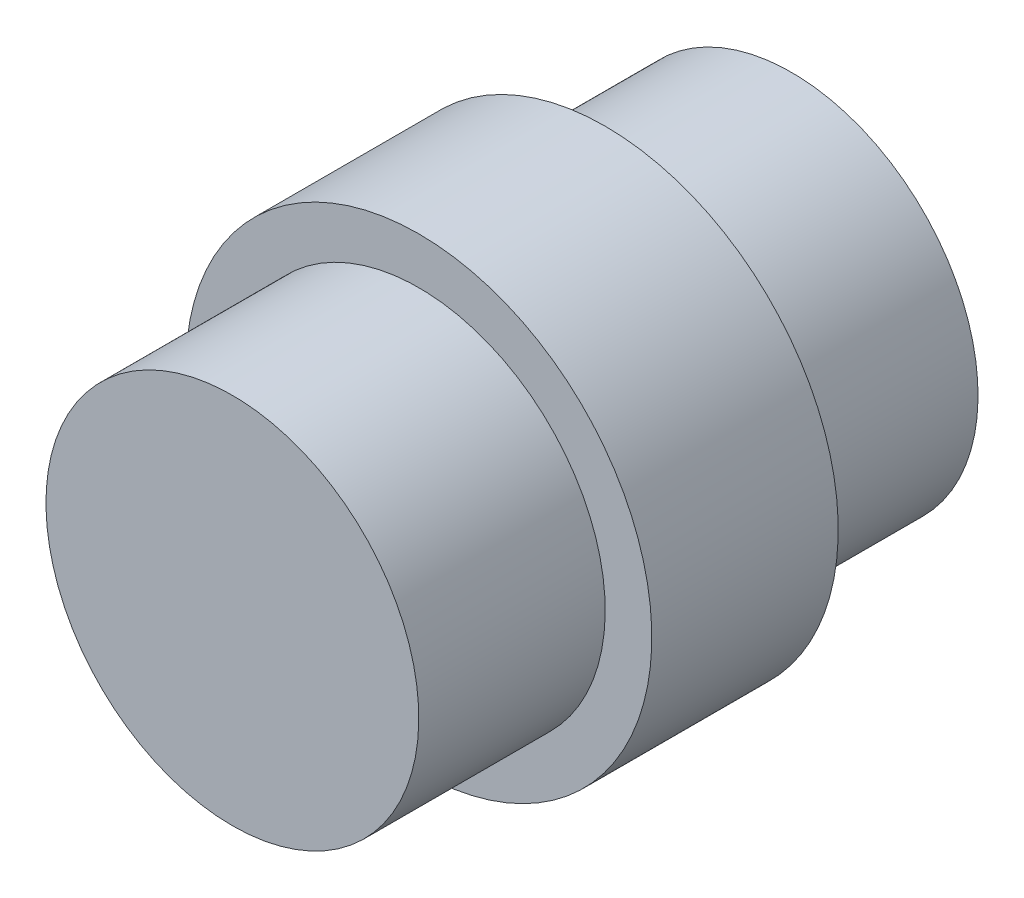
ISO-10303-21;
HEADER;
FILE_DESCRIPTION(('STEP AP214'),'2;1');
FILE_NAME('part.step','',(''),(''),'','','');
FILE_SCHEMA(('AUTOMOTIVE_DESIGN { 1 0 10303 214 1 1 1 1 }'));
ENDSEC;
DATA;
#1=APPLICATION_CONTEXT('core data for automotive mechanical design processes');
#2=APPLICATION_PROTOCOL_DEFINITION('international standard','automotive_design',2000,#1);
#3=PRODUCT_CONTEXT('',#1,'mechanical');
#4=PRODUCT('Part','Part','',(#3));
#5=PRODUCT_RELATED_PRODUCT_CATEGORY('part','',(#4));
#6=PRODUCT_DEFINITION_FORMATION('','',#4);
#7=PRODUCT_DEFINITION_CONTEXT('part definition',#1,'design');
#8=PRODUCT_DEFINITION('design','',#6,#7);
#9=PRODUCT_DEFINITION_SHAPE('','',#8);
#10=(LENGTH_UNIT() NAMED_UNIT(*) SI_UNIT(.MILLI.,.METRE.));
#11=(NAMED_UNIT(*) PLANE_ANGLE_UNIT() SI_UNIT($,.RADIAN.));
#12=(NAMED_UNIT(*) SI_UNIT($,.STERADIAN.) SOLID_ANGLE_UNIT());
#13=UNCERTAINTY_MEASURE_WITH_UNIT(LENGTH_MEASURE(1.E-05),#10,'distance_accuracy_value','');
#14=(GEOMETRIC_REPRESENTATION_CONTEXT(3) GLOBAL_UNCERTAINTY_ASSIGNED_CONTEXT((#13)) GLOBAL_UNIT_ASSIGNED_CONTEXT((#10,
#11,#12)) REPRESENTATION_CONTEXT('',''));
#15=CARTESIAN_POINT('',(0.,0.,0.));
#16=DIRECTION('',(0.,0.,1.));
#17=DIRECTION('',(1.,0.,0.));
#18=AXIS2_PLACEMENT_3D('',#15,#16,#17);
#19=CARTESIAN_POINT('',(-4.99999999999997,0.,4.00000000000003));
#20=DIRECTION('',(0.,0.,-1.));
#21=DIRECTION('',(0.,1.,0.));
#22=AXIS2_PLACEMENT_3D('',#19,#20,#21);
#23=PLANE('',#22);
#24=CARTESIAN_POINT('',(0.,0.,4.));
#25=DIRECTION('',(0.,0.,1.));
#26=DIRECTION('',(0.,-1.,0.));
#27=AXIS2_PLACEMENT_3D('',#24,#25,#26);
#28=CIRCLE('',#27,4.);
#29=CARTESIAN_POINT('',(0.,-4.00000000000001,3.99999999999999));
#30=VERTEX_POINT('',#29);
#31=EDGE_CURVE('E65',#30,#30,#28,.T.);
#32=ORIENTED_EDGE('',*,*,#31,.T.);
#33=EDGE_LOOP('',(#32));
#34=FACE_BOUND('',#33,.T.);
#35=CARTESIAN_POINT('',(0.,0.,4.));
#36=DIRECTION('',(0.,0.,-1.));
#37=DIRECTION('',(0.,1.,0.));
#38=AXIS2_PLACEMENT_3D('',#35,#36,#37);
#39=CIRCLE('',#38,5.);
#40=CARTESIAN_POINT('',(0.,4.99999999999999,4.00000000000002));
#41=VERTEX_POINT('',#40);
#42=EDGE_CURVE('E54',#41,#41,#39,.F.);
#43=ORIENTED_EDGE('',*,*,#42,.F.);
#44=EDGE_LOOP('',(#43));
#45=FACE_BOUND('',#44,.T.);
#46=ADVANCED_FACE('F45',(#34,#45),#23,.T.);
#47=CARTESIAN_POINT('',(0.,0.,6.));
#48=DIRECTION('',(0.,0.,1.));
#49=DIRECTION('',(0.,-1.,0.));
#50=AXIS2_PLACEMENT_3D('',#47,#48,#49);
#51=CYLINDRICAL_SURFACE('',#50,4.);
#52=CARTESIAN_POINT('',(0.,0.,0.));
#53=DIRECTION('',(0.,0.,1.));
#54=DIRECTION('',(0.,-1.,0.));
#55=AXIS2_PLACEMENT_3D('',#52,#53,#54);
#56=CIRCLE('',#55,4.);
#57=CARTESIAN_POINT('',(0.,-4.,0.));
#58=VERTEX_POINT('',#57);
#59=EDGE_CURVE('E49',#58,#58,#56,.T.);
#60=ORIENTED_EDGE('',*,*,#59,.T.);
#61=EDGE_LOOP('',(#60));
#62=FACE_BOUND('',#61,.T.);
#63=ORIENTED_EDGE('',*,*,#31,.F.);
#64=EDGE_LOOP('',(#63));
#65=FACE_BOUND('',#64,.T.);
#66=ADVANCED_FACE('F47',(#62,#65),#51,.T.);
#67=CARTESIAN_POINT('',(0.,0.,6.));
#68=DIRECTION('',(0.,0.,1.));
#69=DIRECTION('',(0.,-1.,0.));
#70=AXIS2_PLACEMENT_3D('',#67,#68,#69);
#71=CYLINDRICAL_SURFACE('',#70,4.);
#72=CARTESIAN_POINT('',(0.,0.,8.));
#73=DIRECTION('',(0.,0.,1.));
#74=DIRECTION('',(0.,-1.,0.));
#75=AXIS2_PLACEMENT_3D('',#72,#73,#74);
#76=CIRCLE('',#75,4.);
#77=CARTESIAN_POINT('',(0.,-4.00000000000003,7.99999999999998));
#78=VERTEX_POINT('',#77);
#79=EDGE_CURVE('E63',#78,#78,#76,.T.);
#80=ORIENTED_EDGE('',*,*,#79,.T.);
#81=EDGE_LOOP('',(#80));
#82=FACE_BOUND('',#81,.T.);
#83=CARTESIAN_POINT('',(0.,0.,12.));
#84=DIRECTION('',(0.,0.,1.));
#85=DIRECTION('',(0.,-1.,0.));
#86=AXIS2_PLACEMENT_3D('',#83,#84,#85);
#87=CIRCLE('',#86,4.);
#88=CARTESIAN_POINT('',(1.11727402842981E-13,-4.00000000000004,12.));
#89=VERTEX_POINT('',#88);
#90=EDGE_CURVE('E10',#89,#89,#87,.T.);
#91=ORIENTED_EDGE('',*,*,#90,.F.);
#92=EDGE_LOOP('',(#91));
#93=FACE_BOUND('',#92,.T.);
#94=ADVANCED_FACE('F90',(#82,#93),#71,.T.);
#95=CARTESIAN_POINT('',(-4.99999999999994,0.,8.00000000000003));
#96=DIRECTION('',(0.,0.,1.));
#97=DIRECTION('',(0.,-1.,0.));
#98=AXIS2_PLACEMENT_3D('',#95,#96,#97);
#99=PLANE('',#98);
#100=CARTESIAN_POINT('',(0.,0.,8.));
#101=DIRECTION('',(0.,0.,1.));
#102=DIRECTION('',(0.,-1.,0.));
#103=AXIS2_PLACEMENT_3D('',#100,#101,#102);
#104=CIRCLE('',#103,5.);
#105=CARTESIAN_POINT('',(0.,-5.00000000000003,7.99999999999998));
#106=VERTEX_POINT('',#105);
#107=EDGE_CURVE('E60',#106,#106,#104,.F.);
#108=ORIENTED_EDGE('',*,*,#107,.F.);
#109=EDGE_LOOP('',(#108));
#110=FACE_BOUND('',#109,.T.);
#111=ORIENTED_EDGE('',*,*,#79,.F.);
#112=EDGE_LOOP('',(#111));
#113=FACE_BOUND('',#112,.T.);
#114=ADVANCED_FACE('F93',(#110,#113),#99,.T.);
#115=CARTESIAN_POINT('',(0.,0.,6.));
#116=DIRECTION('',(0.,0.,1.));
#117=DIRECTION('',(0.,-1.,0.));
#118=AXIS2_PLACEMENT_3D('',#115,#116,#117);
#119=CYLINDRICAL_SURFACE('',#118,5.);
#120=ORIENTED_EDGE('',*,*,#107,.T.);
#121=EDGE_LOOP('',(#120));
#122=FACE_BOUND('',#121,.T.);
#123=ORIENTED_EDGE('',*,*,#42,.T.);
#124=EDGE_LOOP('',(#123));
#125=FACE_BOUND('',#124,.T.);
#126=ADVANCED_FACE('F95',(#122,#125),#119,.T.);
#127=CARTESIAN_POINT('',(0.,0.,0.));
#128=DIRECTION('',(0.,0.,1.));
#129=DIRECTION('',(1.,0.,0.));
#130=AXIS2_PLACEMENT_3D('',#127,#128,#129);
#131=PLANE('',#130);
#132=CARTESIAN_POINT('',(0.,0.,0.));
#133=DIRECTION('',(0.,0.,-1.));
#134=DIRECTION('',(-1.,0.,0.));
#135=AXIS2_PLACEMENT_3D('',#132,#133,#134);
#136=CIRCLE('',#135,1.01);
#137=CARTESIAN_POINT('',(-1.01,0.,0.));
#138=VERTEX_POINT('',#137);
#139=EDGE_CURVE('E75',#138,#138,#136,.T.);
#140=ORIENTED_EDGE('',*,*,#139,.F.);
#141=EDGE_LOOP('',(#140));
#142=FACE_BOUND('',#141,.T.);
#143=ORIENTED_EDGE('',*,*,#59,.F.);
#144=EDGE_LOOP('',(#143));
#145=FACE_BOUND('',#144,.T.);
#146=ADVANCED_FACE('F103',(#142,#145),#131,.F.);
#147=CARTESIAN_POINT('',(0.,0.,12.));
#148=DIRECTION('',(0.,0.,1.));
#149=DIRECTION('',(1.,0.,0.));
#150=AXIS2_PLACEMENT_3D('',#147,#148,#149);
#151=PLANE('',#150);
#152=ORIENTED_EDGE('',*,*,#90,.T.);
#153=EDGE_LOOP('',(#152));
#154=FACE_BOUND('',#153,.T.);
#155=ADVANCED_FACE('F124',(#154),#151,.T.);
#156=CARTESIAN_POINT('',(0.,0.,4.));
#157=DIRECTION('',(0.,0.,-1.));
#158=DIRECTION('',(-1.,0.,0.));
#159=AXIS2_PLACEMENT_3D('',#156,#157,#158);
#160=CYLINDRICAL_SURFACE('',#159,1.01);
#161=CARTESIAN_POINT('',(0.,0.,4.));
#162=DIRECTION('',(0.,0.,-1.));
#163=DIRECTION('',(-1.,0.,0.));
#164=AXIS2_PLACEMENT_3D('',#161,#162,#163);
#165=CIRCLE('',#164,1.01);
#166=CARTESIAN_POINT('',(-1.01,0.,4.));
#167=VERTEX_POINT('',#166);
#168=EDGE_CURVE('E68',#167,#167,#165,.T.);
#169=ORIENTED_EDGE('',*,*,#168,.F.);
#170=EDGE_LOOP('',(#169));
#171=FACE_BOUND('',#170,.T.);
#172=ORIENTED_EDGE('',*,*,#139,.T.);
#173=EDGE_LOOP('',(#172));
#174=FACE_BOUND('',#173,.T.);
#175=ADVANCED_FACE('F131',(#171,#174),#160,.F.);
#176=CARTESIAN_POINT('',(0.,0.,4.));
#177=DIRECTION('',(0.,0.,-1.));
#178=DIRECTION('',(-1.,0.,0.));
#179=AXIS2_PLACEMENT_3D('',#176,#177,#178);
#180=PLANE('',#179);
#181=ORIENTED_EDGE('',*,*,#168,.T.);
#182=EDGE_LOOP('',(#181));
#183=FACE_BOUND('',#182,.T.);
#184=ADVANCED_FACE('F136',(#183),#180,.T.);
#185=CLOSED_SHELL('',(#46,#66,#94,#114,#126,#146,#155,#175,#184));
#186=MANIFOLD_SOLID_BREP('B2',#185);
#187=ADVANCED_BREP_SHAPE_REPRESENTATION('',(#18,#186),#14);
#188=SHAPE_DEFINITION_REPRESENTATION(#9,#187);
ENDSEC;
END-ISO-10303-21;
